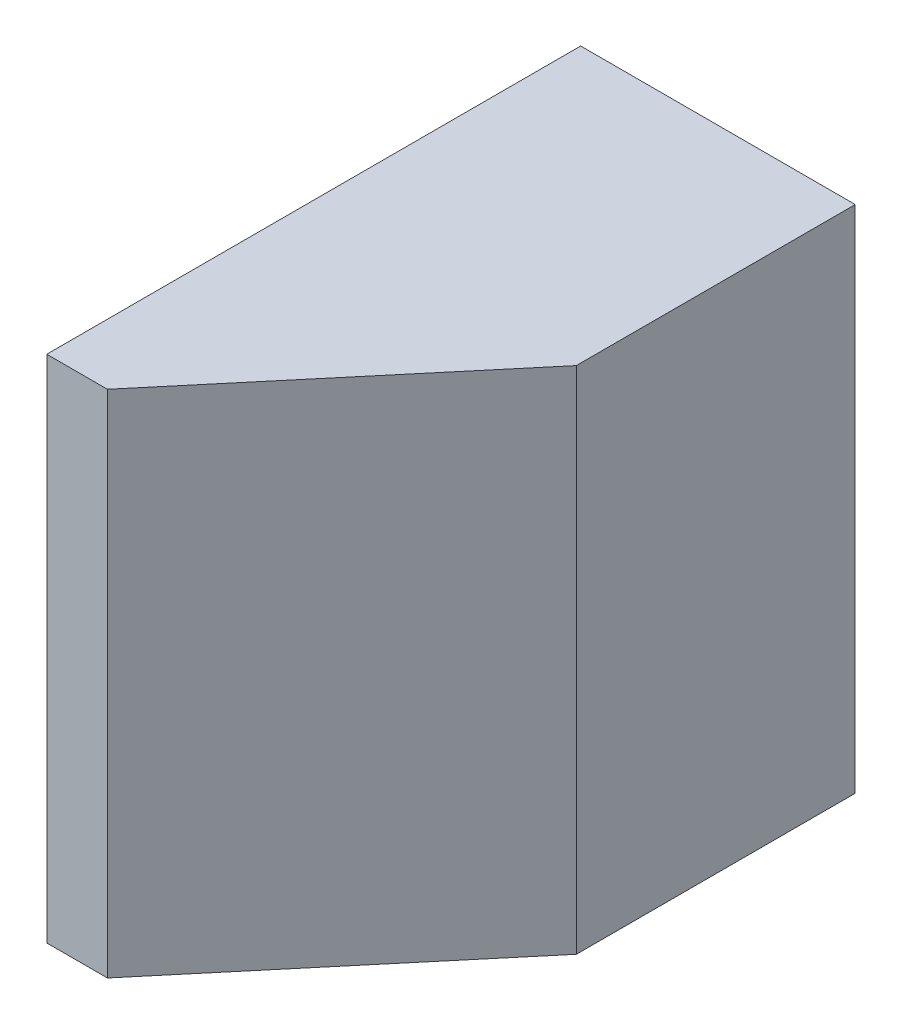
ISO-10303-21;
HEADER;
FILE_DESCRIPTION(('STEP AP214'),'2;1');
FILE_NAME('part.step','',(''),(''),'','','');
FILE_SCHEMA(('AUTOMOTIVE_DESIGN { 1 0 10303 214 1 1 1 1 }'));
ENDSEC;
DATA;
#1=APPLICATION_CONTEXT('core data for automotive mechanical design processes');
#2=APPLICATION_PROTOCOL_DEFINITION('international standard','automotive_design',2000,#1);
#3=PRODUCT_CONTEXT('',#1,'mechanical');
#4=PRODUCT('Part','Part','',(#3));
#5=PRODUCT_RELATED_PRODUCT_CATEGORY('part','',(#4));
#6=PRODUCT_DEFINITION_FORMATION('','',#4);
#7=PRODUCT_DEFINITION_CONTEXT('part definition',#1,'design');
#8=PRODUCT_DEFINITION('design','',#6,#7);
#9=PRODUCT_DEFINITION_SHAPE('','',#8);
#10=(LENGTH_UNIT() NAMED_UNIT(*) SI_UNIT(.MILLI.,.METRE.));
#11=(NAMED_UNIT(*) PLANE_ANGLE_UNIT() SI_UNIT($,.RADIAN.));
#12=(NAMED_UNIT(*) SI_UNIT($,.STERADIAN.) SOLID_ANGLE_UNIT());
#13=UNCERTAINTY_MEASURE_WITH_UNIT(LENGTH_MEASURE(1.E-05),#10,'distance_accuracy_value','');
#14=(GEOMETRIC_REPRESENTATION_CONTEXT(3) GLOBAL_UNCERTAINTY_ASSIGNED_CONTEXT((#13)) GLOBAL_UNIT_ASSIGNED_CONTEXT((#10,
#11,#12)) REPRESENTATION_CONTEXT('',''));
#15=CARTESIAN_POINT('',(0.,0.,0.));
#16=DIRECTION('',(0.,0.,1.));
#17=DIRECTION('',(1.,0.,0.));
#18=AXIS2_PLACEMENT_3D('',#15,#16,#17);
#19=CARTESIAN_POINT('',(-25.,35.,50.8));
#20=DIRECTION('',(-1.,0.,0.));
#21=DIRECTION('',(0.,0.,1.));
#22=AXIS2_PLACEMENT_3D('',#19,#20,#21);
#23=PLANE('',#22);
#24=DIRECTION('',(0.,1.,0.));
#25=VECTOR('',#24,1.);
#26=CARTESIAN_POINT('',(-25.,-21.21,-22.5));
#27=LINE('',#26,#25);
#28=CARTESIAN_POINT('',(-25.,-35.,-22.5));
#29=VERTEX_POINT('',#28);
#30=CARTESIAN_POINT('',(-25.,-21.21,-22.5));
#31=VERTEX_POINT('',#30);
#32=EDGE_CURVE('E59',#29,#31,#27,.T.);
#33=ORIENTED_EDGE('',*,*,#32,.F.);
#34=DIRECTION('',(0.,0.,-1.));
#35=VECTOR('',#34,1.);
#36=CARTESIAN_POINT('',(-25.,-35.,50.8));
#37=LINE('',#36,#35);
#38=CARTESIAN_POINT('',(-25.,-35.,50.8));
#39=VERTEX_POINT('',#38);
#40=EDGE_CURVE('E155',#39,#29,#37,.T.);
#41=ORIENTED_EDGE('',*,*,#40,.F.);
#42=DIRECTION('',(0.,-1.,0.));
#43=VECTOR('',#42,1.);
#44=CARTESIAN_POINT('',(-25.,35.,50.8));
#45=LINE('',#44,#43);
#46=CARTESIAN_POINT('',(-25.,35.,50.8));
#47=VERTEX_POINT('',#46);
#48=EDGE_CURVE('E169',#47,#39,#45,.T.);
#49=ORIENTED_EDGE('',*,*,#48,.F.);
#50=DIRECTION('',(0.,0.,-1.));
#51=VECTOR('',#50,1.);
#52=CARTESIAN_POINT('',(-25.,35.,50.8));
#53=LINE('',#52,#51);
#54=CARTESIAN_POINT('',(-25.,35.,-22.5));
#55=VERTEX_POINT('',#54);
#56=EDGE_CURVE('E163',#47,#55,#53,.T.);
#57=ORIENTED_EDGE('',*,*,#56,.T.);
#58=DIRECTION('',(0.,1.,0.));
#59=VECTOR('',#58,1.);
#60=CARTESIAN_POINT('',(-25.,35.,-22.5));
#61=LINE('',#60,#59);
#62=CARTESIAN_POINT('',(-25.,21.21,-22.5));
#63=VERTEX_POINT('',#62);
#64=EDGE_CURVE('E263',#63,#55,#61,.T.);
#65=ORIENTED_EDGE('',*,*,#64,.F.);
#66=DIRECTION('',(0.,0.,1.));
#67=VECTOR('',#66,1.);
#68=CARTESIAN_POINT('',(-25.,21.21,50.8));
#69=LINE('',#68,#67);
#70=CARTESIAN_POINT('',(-25.,21.21,-0.566132075471791));
#71=VERTEX_POINT('',#70);
#72=EDGE_CURVE('E165',#63,#71,#69,.T.);
#73=ORIENTED_EDGE('',*,*,#72,.T.);
#74=DIRECTION('',(0.,-1.,0.));
#75=VECTOR('',#74,1.);
#76=CARTESIAN_POINT('',(-25.,35.,-0.566132075471792));
#77=LINE('',#76,#75);
#78=CARTESIAN_POINT('',(-25.,-21.21,-0.566132075471792));
#79=VERTEX_POINT('',#78);
#80=EDGE_CURVE('E171',#79,#71,#77,.F.);
#81=ORIENTED_EDGE('',*,*,#80,.F.);
#82=DIRECTION('',(0.,0.,1.));
#83=VECTOR('',#82,1.);
#84=CARTESIAN_POINT('',(-25.,-21.21,50.8));
#85=LINE('',#84,#83);
#86=CARTESIAN_POINT('',(-25.,-21.21,-10.3525));
#87=VERTEX_POINT('',#86);
#88=EDGE_CURVE('E220',#87,#79,#85,.T.);
#89=ORIENTED_EDGE('',*,*,#88,.F.);
#90=DIRECTION('',(0.,1.,0.));
#91=VECTOR('',#90,1.);
#92=CARTESIAN_POINT('',(-25.,35.,-10.3525));
#93=LINE('',#92,#91);
#94=CARTESIAN_POINT('',(-25.,-25.755,-10.3525));
#95=VERTEX_POINT('',#94);
#96=EDGE_CURVE('E175',#95,#87,#93,.T.);
#97=ORIENTED_EDGE('',*,*,#96,.F.);
#98=DIRECTION('',(0.,0.,-1.));
#99=VECTOR('',#98,1.);
#100=CARTESIAN_POINT('',(-25.,-25.755,50.8));
#101=LINE('',#100,#99);
#102=CARTESIAN_POINT('',(-25.,-25.755,-21.4625));
#103=VERTEX_POINT('',#102);
#104=EDGE_CURVE('E52',#95,#103,#101,.T.);
#105=ORIENTED_EDGE('',*,*,#104,.T.);
#106=DIRECTION('',(0.,1.,0.));
#107=VECTOR('',#106,1.);
#108=CARTESIAN_POINT('',(-25.,35.,-21.4625));
#109=LINE('',#108,#107);
#110=CARTESIAN_POINT('',(-25.,-21.21,-21.4625));
#111=VERTEX_POINT('',#110);
#112=EDGE_CURVE('E11',#103,#111,#109,.T.);
#113=ORIENTED_EDGE('',*,*,#112,.T.);
#114=EDGE_CURVE('E218',#31,#111,#85,.T.);
#115=ORIENTED_EDGE('',*,*,#114,.F.);
#116=EDGE_LOOP('',(#33,#41,#49,#57,#65,#73,#81,#89,#97,#105,#113,#115));
#117=FACE_BOUND('',#116,.T.);
#118=ADVANCED_FACE('F45',(#117),#23,.T.);
#119=CARTESIAN_POINT('',(-25.,35.,50.8));
#120=DIRECTION('',(0.,0.,-1.));
#121=DIRECTION('',(-1.,0.,0.));
#122=AXIS2_PLACEMENT_3D('',#119,#120,#121);
#123=PLANE('',#122);
#124=DIRECTION('',(1.,0.,0.));
#125=VECTOR('',#124,1.);
#126=CARTESIAN_POINT('',(-25.,-35.,50.8));
#127=LINE('',#126,#125);
#128=CARTESIAN_POINT('',(-16.6725864484225,-35.,50.8));
#129=VERTEX_POINT('',#128);
#130=EDGE_CURVE('E160',#39,#129,#127,.T.);
#131=ORIENTED_EDGE('',*,*,#130,.T.);
#132=DIRECTION('',(0.,1.,0.));
#133=VECTOR('',#132,1.);
#134=CARTESIAN_POINT('',(-16.6725864484225,-35.,50.8));
#135=LINE('',#134,#133);
#136=CARTESIAN_POINT('',(-16.6725864484225,35.,50.8));
#137=VERTEX_POINT('',#136);
#138=EDGE_CURVE('E67',#129,#137,#135,.T.);
#139=ORIENTED_EDGE('',*,*,#138,.T.);
#140=DIRECTION('',(1.,0.,0.));
#141=VECTOR('',#140,1.);
#142=CARTESIAN_POINT('',(-25.,35.,50.8));
#143=LINE('',#142,#141);
#144=EDGE_CURVE('E172',#47,#137,#143,.T.);
#145=ORIENTED_EDGE('',*,*,#144,.F.);
#146=ORIENTED_EDGE('',*,*,#48,.T.);
#147=EDGE_LOOP('',(#131,#139,#145,#146));
#148=FACE_BOUND('',#147,.T.);
#149=ADVANCED_FACE('F233',(#148),#123,.F.);
#150=CARTESIAN_POINT('',(12.7,35.,50.8));
#151=DIRECTION('',(-1.,0.,0.));
#152=DIRECTION('',(0.,0.,1.));
#153=AXIS2_PLACEMENT_3D('',#150,#151,#152);
#154=PLANE('',#153);
#155=DIRECTION('',(0.,0.,-1.));
#156=VECTOR('',#155,1.);
#157=CARTESIAN_POINT('',(12.7,-35.,50.8));
#158=LINE('',#157,#156);
#159=CARTESIAN_POINT('',(12.7,-35.,15.7951145763081));
#160=VERTEX_POINT('',#159);
#161=CARTESIAN_POINT('',(12.7,-35.,-22.5));
#162=VERTEX_POINT('',#161);
#163=EDGE_CURVE('E152',#160,#162,#158,.T.);
#164=ORIENTED_EDGE('',*,*,#163,.T.);
#165=DIRECTION('',(0.,-1.,0.));
#166=VECTOR('',#165,1.);
#167=CARTESIAN_POINT('',(12.7,-35.,-22.5));
#168=LINE('',#167,#166);
#169=CARTESIAN_POINT('',(12.7,35.,-22.5));
#170=VERTEX_POINT('',#169);
#171=EDGE_CURVE('E137',#170,#162,#168,.T.);
#172=ORIENTED_EDGE('',*,*,#171,.F.);
#173=DIRECTION('',(0.,0.,-1.));
#174=VECTOR('',#173,1.);
#175=CARTESIAN_POINT('',(12.7,35.,50.8));
#176=LINE('',#175,#174);
#177=CARTESIAN_POINT('',(12.7,35.,15.7951145763081));
#178=VERTEX_POINT('',#177);
#179=EDGE_CURVE('E224',#178,#170,#176,.T.);
#180=ORIENTED_EDGE('',*,*,#179,.F.);
#181=DIRECTION('',(0.,1.,0.));
#182=VECTOR('',#181,1.);
#183=CARTESIAN_POINT('',(12.7,-35.,15.7951145763081));
#184=LINE('',#183,#182);
#185=EDGE_CURVE('E159',#160,#178,#184,.T.);
#186=ORIENTED_EDGE('',*,*,#185,.F.);
#187=EDGE_LOOP('',(#164,#172,#180,#186));
#188=FACE_BOUND('',#187,.T.);
#189=ADVANCED_FACE('F158',(#188),#154,.F.);
#190=CARTESIAN_POINT('',(0.,35.,0.));
#191=DIRECTION('',(0.,-1.,0.));
#192=DIRECTION('',(0.,0.,-1.));
#193=AXIS2_PLACEMENT_3D('',#190,#191,#192);
#194=PLANE('',#193);
#195=ORIENTED_EDGE('',*,*,#179,.T.);
#196=DIRECTION('',(1.,0.,0.));
#197=VECTOR('',#196,1.);
#198=CARTESIAN_POINT('',(12.7,35.,-22.5));
#199=LINE('',#198,#197);
#200=EDGE_CURVE('E142',#55,#170,#199,.T.);
#201=ORIENTED_EDGE('',*,*,#200,.F.);
#202=ORIENTED_EDGE('',*,*,#56,.F.);
#203=ORIENTED_EDGE('',*,*,#144,.T.);
#204=DIRECTION('',(-0.642787609686535,0.,0.766044443118982));
#205=VECTOR('',#204,1.);
#206=CARTESIAN_POINT('',(12.7,35.,15.7951145763081));
#207=LINE('',#206,#205);
#208=EDGE_CURVE('E231',#178,#137,#207,.T.);
#209=ORIENTED_EDGE('',*,*,#208,.F.);
#210=EDGE_LOOP('',(#195,#201,#202,#203,#209));
#211=FACE_BOUND('',#210,.T.);
#212=ADVANCED_FACE('F230',(#211),#194,.F.);
#213=CARTESIAN_POINT('',(0.,-35.,0.));
#214=DIRECTION('',(0.,-1.,0.));
#215=DIRECTION('',(0.,0.,-1.));
#216=AXIS2_PLACEMENT_3D('',#213,#214,#215);
#217=PLANE('',#216);
#218=DIRECTION('',(-1.,0.,0.));
#219=VECTOR('',#218,1.);
#220=CARTESIAN_POINT('',(-25.,-35.,-22.5));
#221=LINE('',#220,#219);
#222=EDGE_CURVE('E140',#162,#29,#221,.T.);
#223=ORIENTED_EDGE('',*,*,#222,.F.);
#224=ORIENTED_EDGE('',*,*,#163,.F.);
#225=DIRECTION('',(-0.642787609686535,0.,0.766044443118982));
#226=VECTOR('',#225,1.);
#227=CARTESIAN_POINT('',(12.7,-35.,15.7951145763081));
#228=LINE('',#227,#226);
#229=EDGE_CURVE('E238',#160,#129,#228,.T.);
#230=ORIENTED_EDGE('',*,*,#229,.T.);
#231=ORIENTED_EDGE('',*,*,#130,.F.);
#232=ORIENTED_EDGE('',*,*,#40,.T.);
#233=EDGE_LOOP('',(#223,#224,#230,#231,#232));
#234=FACE_BOUND('',#233,.T.);
#235=ADVANCED_FACE('F151',(#234),#217,.T.);
#236=CARTESIAN_POINT('',(0.,21.21,0.));
#237=DIRECTION('',(-1.,0.,0.));
#238=DIRECTION('',(0.,0.,1.));
#239=AXIS2_PLACEMENT_3D('',#236,#237,#238);
#240=PLANE('',#239);
#241=DIRECTION('',(0.,1.,0.));
#242=VECTOR('',#241,1.);
#243=CARTESIAN_POINT('',(0.,21.21,-22.5));
#244=LINE('',#243,#242);
#245=CARTESIAN_POINT('',(0.,-21.21,-22.5));
#246=VERTEX_POINT('',#245);
#247=CARTESIAN_POINT('',(0.,21.21,-22.5));
#248=VERTEX_POINT('',#247);
#249=EDGE_CURVE('E257',#246,#248,#244,.T.);
#250=ORIENTED_EDGE('',*,*,#249,.F.);
#251=DIRECTION('',(0.,0.,-1.));
#252=VECTOR('',#251,1.);
#253=CARTESIAN_POINT('',(0.,-21.21,0.));
#254=LINE('',#253,#252);
#255=CARTESIAN_POINT('',(0.,-21.21,-8.58500000000001));
#256=VERTEX_POINT('',#255);
#257=EDGE_CURVE('E207',#256,#246,#254,.T.);
#258=ORIENTED_EDGE('',*,*,#257,.F.);
#259=DIRECTION('',(0.,-1.,0.));
#260=VECTOR('',#259,1.);
#261=CARTESIAN_POINT('',(0.,21.21,-8.58500000000001));
#262=LINE('',#261,#260);
#263=CARTESIAN_POINT('',(0.,21.21,-8.58500000000001));
#264=VERTEX_POINT('',#263);
#265=EDGE_CURVE('E215',#264,#256,#262,.T.);
#266=ORIENTED_EDGE('',*,*,#265,.F.);
#267=DIRECTION('',(0.,0.,-1.));
#268=VECTOR('',#267,1.);
#269=CARTESIAN_POINT('',(0.,21.21,0.));
#270=LINE('',#269,#268);
#271=EDGE_CURVE('E203',#264,#248,#270,.T.);
#272=ORIENTED_EDGE('',*,*,#271,.T.);
#273=EDGE_LOOP('',(#250,#258,#266,#272));
#274=FACE_BOUND('',#273,.T.);
#275=ADVANCED_FACE('F288',(#274),#240,.T.);
#276=CARTESIAN_POINT('',(-226.24,21.21,0.));
#277=DIRECTION('',(0.,-1.,0.));
#278=DIRECTION('',(0.,0.,-1.));
#279=AXIS2_PLACEMENT_3D('',#276,#277,#278);
#280=PLANE('',#279);
#281=DIRECTION('',(-1.,0.,0.));
#282=VECTOR('',#281,1.);
#283=CARTESIAN_POINT('',(-25.,21.21,-22.5));
#284=LINE('',#283,#282);
#285=EDGE_CURVE('E261',#248,#63,#284,.T.);
#286=ORIENTED_EDGE('',*,*,#285,.F.);
#287=ORIENTED_EDGE('',*,*,#271,.F.);
#288=DIRECTION('',(-0.952215316531976,0.,0.30542755435931));
#289=VECTOR('',#288,1.);
#290=CARTESIAN_POINT('',(0.,21.21,-8.58500000000001));
#291=LINE('',#290,#289);
#292=EDGE_CURVE('E213',#71,#264,#291,.F.);
#293=ORIENTED_EDGE('',*,*,#292,.F.);
#294=ORIENTED_EDGE('',*,*,#72,.F.);
#295=EDGE_LOOP('',(#286,#287,#293,#294));
#296=FACE_BOUND('',#295,.T.);
#297=ADVANCED_FACE('F293',(#296),#280,.T.);
#298=CARTESIAN_POINT('',(-226.24,-21.21,0.));
#299=DIRECTION('',(0.,-1.,0.));
#300=DIRECTION('',(0.,0.,-1.));
#301=AXIS2_PLACEMENT_3D('',#298,#299,#300);
#302=PLANE('',#301);
#303=ORIENTED_EDGE('',*,*,#257,.T.);
#304=DIRECTION('',(1.,0.,0.));
#305=VECTOR('',#304,1.);
#306=CARTESIAN_POINT('',(0.,-21.21,-22.5));
#307=LINE('',#306,#305);
#308=EDGE_CURVE('E255',#31,#246,#307,.T.);
#309=ORIENTED_EDGE('',*,*,#308,.F.);
#310=ORIENTED_EDGE('',*,*,#114,.T.);
#311=DIRECTION('',(1.,0.,0.));
#312=VECTOR('',#311,1.);
#313=CARTESIAN_POINT('',(-201.495,-21.21,-21.4625));
#314=LINE('',#313,#312);
#315=CARTESIAN_POINT('',(-24.745,-21.21,-21.4625));
#316=VERTEX_POINT('',#315);
#317=EDGE_CURVE('E195',#111,#316,#314,.T.);
#318=ORIENTED_EDGE('',*,*,#317,.T.);
#319=DIRECTION('',(0.,0.,-1.));
#320=VECTOR('',#319,1.);
#321=CARTESIAN_POINT('',(-24.745,-21.21,-10.3525));
#322=LINE('',#321,#320);
#323=CARTESIAN_POINT('',(-24.745,-21.21,-10.3525));
#324=VERTEX_POINT('',#323);
#325=EDGE_CURVE('E198',#324,#316,#322,.T.);
#326=ORIENTED_EDGE('',*,*,#325,.F.);
#327=DIRECTION('',(1.,0.,0.));
#328=VECTOR('',#327,1.);
#329=CARTESIAN_POINT('',(-201.495,-21.21,-10.3525));
#330=LINE('',#329,#328);
#331=EDGE_CURVE('E210',#87,#324,#330,.T.);
#332=ORIENTED_EDGE('',*,*,#331,.F.);
#333=ORIENTED_EDGE('',*,*,#88,.T.);
#334=DIRECTION('',(0.952215316531976,0.,-0.30542755435931));
#335=VECTOR('',#334,1.);
#336=CARTESIAN_POINT('',(-207.631776952873,-21.21,58.0138718528077));
#337=LINE('',#336,#335);
#338=EDGE_CURVE('E206',#256,#79,#337,.F.);
#339=ORIENTED_EDGE('',*,*,#338,.F.);
#340=EDGE_LOOP('',(#303,#309,#310,#318,#326,#332,#333,#339));
#341=FACE_BOUND('',#340,.T.);
#342=ADVANCED_FACE('F254',(#341),#302,.F.);
#343=CARTESIAN_POINT('',(-201.495,-25.755,-10.3525));
#344=DIRECTION('',(0.,0.,1.));
#345=DIRECTION('',(1.,0.,0.));
#346=AXIS2_PLACEMENT_3D('',#343,#344,#345);
#347=PLANE('',#346);
#348=ORIENTED_EDGE('',*,*,#96,.T.);
#349=ORIENTED_EDGE('',*,*,#331,.T.);
#350=DIRECTION('',(0.,1.,0.));
#351=VECTOR('',#350,1.);
#352=CARTESIAN_POINT('',(-24.745,-25.755,-10.3525));
#353=LINE('',#352,#351);
#354=CARTESIAN_POINT('',(-24.745,-25.755,-10.3525));
#355=VERTEX_POINT('',#354);
#356=EDGE_CURVE('E193',#355,#324,#353,.T.);
#357=ORIENTED_EDGE('',*,*,#356,.F.);
#358=DIRECTION('',(1.,0.,0.));
#359=VECTOR('',#358,1.);
#360=CARTESIAN_POINT('',(-201.495,-25.755,-10.3525));
#361=LINE('',#360,#359);
#362=EDGE_CURVE('E186',#95,#355,#361,.T.);
#363=ORIENTED_EDGE('',*,*,#362,.F.);
#364=EDGE_LOOP('',(#348,#349,#357,#363));
#365=FACE_BOUND('',#364,.T.);
#366=ADVANCED_FACE('F190',(#365),#347,.F.);
#367=CARTESIAN_POINT('',(-201.495,-25.755,-21.4625));
#368=DIRECTION('',(0.,0.,1.));
#369=DIRECTION('',(1.,0.,0.));
#370=AXIS2_PLACEMENT_3D('',#367,#368,#369);
#371=PLANE('',#370);
#372=DIRECTION('',(1.,0.,0.));
#373=VECTOR('',#372,1.);
#374=CARTESIAN_POINT('',(-201.495,-25.755,-21.4625));
#375=LINE('',#374,#373);
#376=CARTESIAN_POINT('',(-24.745,-25.755,-21.4625));
#377=VERTEX_POINT('',#376);
#378=EDGE_CURVE('E188',#103,#377,#375,.T.);
#379=ORIENTED_EDGE('',*,*,#378,.T.);
#380=DIRECTION('',(0.,1.,0.));
#381=VECTOR('',#380,1.);
#382=CARTESIAN_POINT('',(-24.745,-25.755,-21.4625));
#383=LINE('',#382,#381);
#384=EDGE_CURVE('E234',#377,#316,#383,.T.);
#385=ORIENTED_EDGE('',*,*,#384,.T.);
#386=ORIENTED_EDGE('',*,*,#317,.F.);
#387=ORIENTED_EDGE('',*,*,#112,.F.);
#388=EDGE_LOOP('',(#379,#385,#386,#387));
#389=FACE_BOUND('',#388,.T.);
#390=ADVANCED_FACE('F248',(#389),#371,.T.);
#391=CARTESIAN_POINT('',(-24.745,-25.755,-10.3525));
#392=DIRECTION('',(1.,0.,0.));
#393=DIRECTION('',(0.,0.,-1.));
#394=AXIS2_PLACEMENT_3D('',#391,#392,#393);
#395=PLANE('',#394);
#396=ORIENTED_EDGE('',*,*,#325,.T.);
#397=ORIENTED_EDGE('',*,*,#384,.F.);
#398=DIRECTION('',(0.,0.,-1.));
#399=VECTOR('',#398,1.);
#400=CARTESIAN_POINT('',(-24.745,-25.755,-10.3525));
#401=LINE('',#400,#399);
#402=EDGE_CURVE('E196',#355,#377,#401,.T.);
#403=ORIENTED_EDGE('',*,*,#402,.F.);
#404=ORIENTED_EDGE('',*,*,#356,.T.);
#405=EDGE_LOOP('',(#396,#397,#403,#404));
#406=FACE_BOUND('',#405,.T.);
#407=ADVANCED_FACE('F251',(#406),#395,.F.);
#408=CARTESIAN_POINT('',(-226.24,-25.755,0.));
#409=DIRECTION('',(0.,1.,0.));
#410=DIRECTION('',(0.,0.,1.));
#411=AXIS2_PLACEMENT_3D('',#408,#409,#410);
#412=PLANE('',#411);
#413=ORIENTED_EDGE('',*,*,#362,.T.);
#414=ORIENTED_EDGE('',*,*,#402,.T.);
#415=ORIENTED_EDGE('',*,*,#378,.F.);
#416=ORIENTED_EDGE('',*,*,#104,.F.);
#417=EDGE_LOOP('',(#413,#414,#415,#416));
#418=FACE_BOUND('',#417,.T.);
#419=ADVANCED_FACE('F184',(#418),#412,.T.);
#420=CARTESIAN_POINT('',(0.,21.21,-8.58500000000001));
#421=DIRECTION('',(-0.30542755435931,0.,-0.952215316531976));
#422=DIRECTION('',(0.,-1.,0.));
#423=AXIS2_PLACEMENT_3D('',#420,#421,#422);
#424=PLANE('',#423);
#425=ORIENTED_EDGE('',*,*,#80,.T.);
#426=ORIENTED_EDGE('',*,*,#292,.T.);
#427=ORIENTED_EDGE('',*,*,#265,.T.);
#428=ORIENTED_EDGE('',*,*,#338,.T.);
#429=EDGE_LOOP('',(#425,#426,#427,#428));
#430=FACE_BOUND('',#429,.T.);
#431=ADVANCED_FACE('F267',(#430),#424,.T.);
#432=CARTESIAN_POINT('',(12.7,-35.,15.7951145763081));
#433=DIRECTION('',(-0.766044443118982,0.,-0.642787609686535));
#434=DIRECTION('',(-0.642787609686535,0.,0.766044443118982));
#435=AXIS2_PLACEMENT_3D('',#432,#433,#434);
#436=PLANE('',#435);
#437=ORIENTED_EDGE('',*,*,#208,.T.);
#438=ORIENTED_EDGE('',*,*,#138,.F.);
#439=ORIENTED_EDGE('',*,*,#229,.F.);
#440=ORIENTED_EDGE('',*,*,#185,.T.);
#441=EDGE_LOOP('',(#437,#438,#439,#440));
#442=FACE_BOUND('',#441,.T.);
#443=ADVANCED_FACE('F265',(#442),#436,.F.);
#444=CARTESIAN_POINT('',(0.,0.,-22.5));
#445=DIRECTION('',(0.,0.,1.));
#446=DIRECTION('',(1.,0.,0.));
#447=AXIS2_PLACEMENT_3D('',#444,#445,#446);
#448=PLANE('',#447);
#449=ORIENTED_EDGE('',*,*,#171,.T.);
#450=ORIENTED_EDGE('',*,*,#222,.T.);
#451=ORIENTED_EDGE('',*,*,#32,.T.);
#452=ORIENTED_EDGE('',*,*,#308,.T.);
#453=ORIENTED_EDGE('',*,*,#249,.T.);
#454=ORIENTED_EDGE('',*,*,#285,.T.);
#455=ORIENTED_EDGE('',*,*,#64,.T.);
#456=ORIENTED_EDGE('',*,*,#200,.T.);
#457=EDGE_LOOP('',(#449,#450,#451,#452,#453,#454,#455,#456));
#458=FACE_BOUND('',#457,.T.);
#459=ADVANCED_FACE('F139',(#458),#448,.F.);
#460=CLOSED_SHELL('',(#118,#149,#189,#212,#235,#275,#297,#342,#366,#390,#407,#419,#431,#443,#459));
#461=MANIFOLD_SOLID_BREP('B2',#460);
#462=ADVANCED_BREP_SHAPE_REPRESENTATION('',(#18,#461),#14);
#463=SHAPE_DEFINITION_REPRESENTATION(#9,#462);
ENDSEC;
END-ISO-10303-21;
